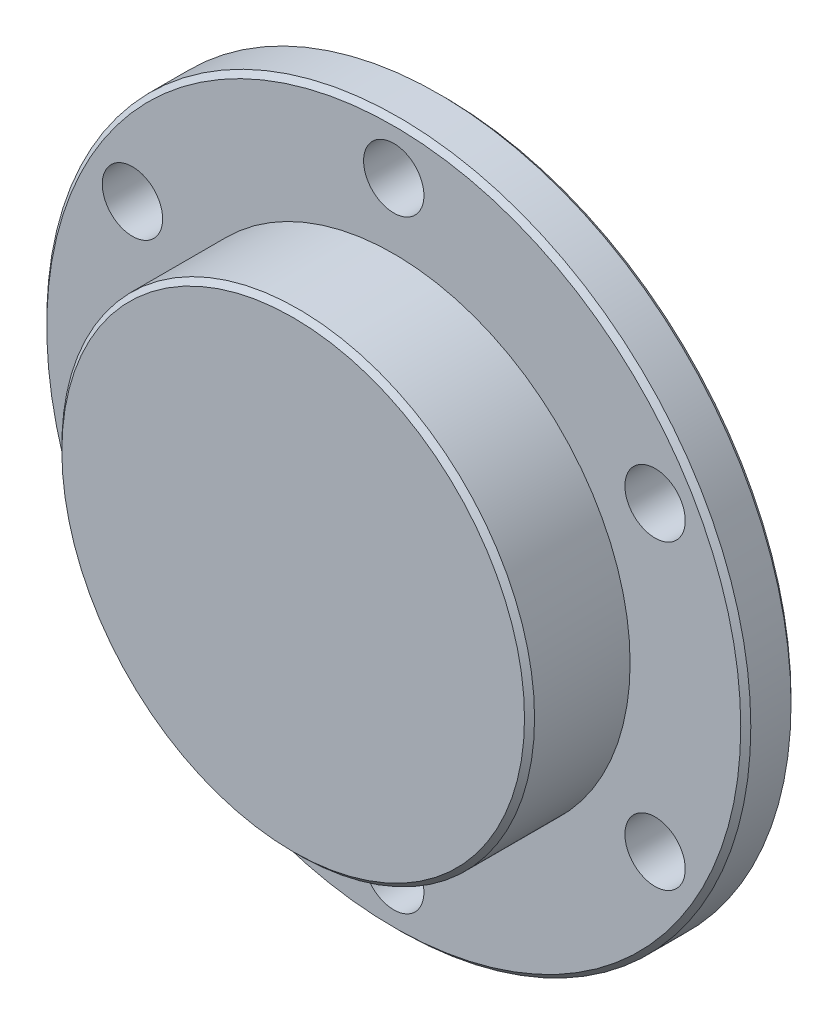
ISO-10303-21;
HEADER;
FILE_DESCRIPTION(('STEP AP214'),'2;1');
FILE_NAME('part.step','',(''),(''),'','','');
FILE_SCHEMA(('AUTOMOTIVE_DESIGN { 1 0 10303 214 1 1 1 1 }'));
ENDSEC;
DATA;
#1=APPLICATION_CONTEXT('core data for automotive mechanical design processes');
#2=APPLICATION_PROTOCOL_DEFINITION('international standard','automotive_design',2000,#1);
#3=PRODUCT_CONTEXT('',#1,'mechanical');
#4=PRODUCT('Part','Part','',(#3));
#5=PRODUCT_RELATED_PRODUCT_CATEGORY('part','',(#4));
#6=PRODUCT_DEFINITION_FORMATION('','',#4);
#7=PRODUCT_DEFINITION_CONTEXT('part definition',#1,'design');
#8=PRODUCT_DEFINITION('design','',#6,#7);
#9=PRODUCT_DEFINITION_SHAPE('','',#8);
#10=(LENGTH_UNIT() NAMED_UNIT(*) SI_UNIT(.MILLI.,.METRE.));
#11=(NAMED_UNIT(*) PLANE_ANGLE_UNIT() SI_UNIT($,.RADIAN.));
#12=(NAMED_UNIT(*) SI_UNIT($,.STERADIAN.) SOLID_ANGLE_UNIT());
#13=UNCERTAINTY_MEASURE_WITH_UNIT(LENGTH_MEASURE(1.E-05),#10,'distance_accuracy_value','');
#14=(GEOMETRIC_REPRESENTATION_CONTEXT(3) GLOBAL_UNCERTAINTY_ASSIGNED_CONTEXT((#13)) GLOBAL_UNIT_ASSIGNED_CONTEXT((#10,
#11,#12)) REPRESENTATION_CONTEXT('',''));
#15=CARTESIAN_POINT('',(0.,0.,0.));
#16=DIRECTION('',(0.,0.,1.));
#17=DIRECTION('',(1.,0.,0.));
#18=AXIS2_PLACEMENT_3D('',#15,#16,#17);
#19=CARTESIAN_POINT('',(0.,0.,5.));
#20=DIRECTION('',(0.,0.,1.));
#21=DIRECTION('',(1.,0.,0.));
#22=AXIS2_PLACEMENT_3D('',#19,#20,#21);
#23=PLANE('',#22);
#24=CARTESIAN_POINT('',(0.,0.,5.));
#25=DIRECTION('',(0.,0.,1.));
#26=DIRECTION('',(1.,0.,0.));
#27=AXIS2_PLACEMENT_3D('',#24,#25,#26);
#28=CIRCLE('',#27,34.5);
#29=CARTESIAN_POINT('',(34.5,0.,5.));
#30=VERTEX_POINT('',#29);
#31=EDGE_CURVE('E39',#30,#30,#28,.T.);
#32=ORIENTED_EDGE('',*,*,#31,.T.);
#33=EDGE_LOOP('',(#32));
#34=FACE_BOUND('',#33,.T.);
#35=CARTESIAN_POINT('',(-25.9807621135323,15.0000000000001,5.));
#36=DIRECTION('',(0.,0.,1.));
#37=DIRECTION('',(1.,0.,0.));
#38=AXIS2_PLACEMENT_3D('',#35,#36,#37);
#39=CIRCLE('',#38,3.);
#40=CARTESIAN_POINT('',(-22.9807621135323,15.0000000000001,5.));
#41=VERTEX_POINT('',#40);
#42=EDGE_CURVE('E65',#41,#41,#39,.T.);
#43=ORIENTED_EDGE('',*,*,#42,.F.);
#44=EDGE_LOOP('',(#43));
#45=FACE_BOUND('',#44,.T.);
#46=CARTESIAN_POINT('',(-25.9807621135326,-14.9999999999995,5.));
#47=DIRECTION('',(0.,0.,1.));
#48=DIRECTION('',(1.,0.,0.));
#49=AXIS2_PLACEMENT_3D('',#46,#47,#48);
#50=CIRCLE('',#49,3.00000000000036);
#51=CARTESIAN_POINT('',(-22.9807621135322,-14.9999999999995,5.));
#52=VERTEX_POINT('',#51);
#53=EDGE_CURVE('E64',#52,#52,#50,.T.);
#54=ORIENTED_EDGE('',*,*,#53,.F.);
#55=EDGE_LOOP('',(#54));
#56=FACE_BOUND('',#55,.T.);
#57=CARTESIAN_POINT('',(-2.09489001666563E-13,-30.,5.));
#58=DIRECTION('',(0.,0.,1.));
#59=DIRECTION('',(1.,0.,0.));
#60=AXIS2_PLACEMENT_3D('',#57,#58,#59);
#61=CIRCLE('',#60,3.);
#62=CARTESIAN_POINT('',(2.99999999999979,-30.,5.));
#63=VERTEX_POINT('',#62);
#64=EDGE_CURVE('E69',#63,#63,#61,.T.);
#65=ORIENTED_EDGE('',*,*,#64,.F.);
#66=EDGE_LOOP('',(#65));
#67=FACE_BOUND('',#66,.T.);
#68=CARTESIAN_POINT('',(25.9807621135331,-15.0000000000001,5.));
#69=DIRECTION('',(0.,0.,1.));
#70=DIRECTION('',(1.,0.,0.));
#71=AXIS2_PLACEMENT_3D('',#68,#69,#70);
#72=CIRCLE('',#71,3.);
#73=CARTESIAN_POINT('',(28.9807621135331,-15.0000000000001,5.));
#74=VERTEX_POINT('',#73);
#75=EDGE_CURVE('E73',#74,#74,#72,.T.);
#76=ORIENTED_EDGE('',*,*,#75,.F.);
#77=EDGE_LOOP('',(#76));
#78=FACE_BOUND('',#77,.T.);
#79=CARTESIAN_POINT('',(25.9807621135332,14.9999999999999,5.));
#80=DIRECTION('',(0.,0.,1.));
#81=DIRECTION('',(1.,0.,0.));
#82=AXIS2_PLACEMENT_3D('',#79,#80,#81);
#83=CIRCLE('',#82,3.);
#84=CARTESIAN_POINT('',(28.9807621135332,14.9999999999999,5.));
#85=VERTEX_POINT('',#84);
#86=EDGE_CURVE('E77',#85,#85,#83,.T.);
#87=ORIENTED_EDGE('',*,*,#86,.F.);
#88=EDGE_LOOP('',(#87));
#89=FACE_BOUND('',#88,.T.);
#90=CARTESIAN_POINT('',(7.79702456335843E-13,29.9999999999996,5.));
#91=DIRECTION('',(0.,0.,1.));
#92=DIRECTION('',(1.,0.,0.));
#93=AXIS2_PLACEMENT_3D('',#90,#91,#92);
#94=CIRCLE('',#93,2.99999999999936);
#95=CARTESIAN_POINT('',(3.00000000000014,29.9999999999996,5.));
#96=VERTEX_POINT('',#95);
#97=EDGE_CURVE('E81',#96,#96,#94,.T.);
#98=ORIENTED_EDGE('',*,*,#97,.F.);
#99=EDGE_LOOP('',(#98));
#100=FACE_BOUND('',#99,.T.);
#101=CARTESIAN_POINT('',(0.,0.,5.));
#102=DIRECTION('',(0.,0.,1.));
#103=DIRECTION('',(1.,0.,0.));
#104=AXIS2_PLACEMENT_3D('',#101,#102,#103);
#105=CIRCLE('',#104,23.5);
#106=CARTESIAN_POINT('',(23.5,0.,5.));
#107=VERTEX_POINT('',#106);
#108=EDGE_CURVE('E60',#107,#107,#105,.T.);
#109=ORIENTED_EDGE('',*,*,#108,.F.);
#110=EDGE_LOOP('',(#109));
#111=FACE_BOUND('',#110,.T.);
#112=ADVANCED_FACE('F28',(#34,#45,#56,#67,#78,#89,#100,#111),#23,.T.);
#113=CARTESIAN_POINT('',(0.,0.,5.));
#114=DIRECTION('',(0.,0.,-1.));
#115=DIRECTION('',(-1.,0.,0.));
#116=AXIS2_PLACEMENT_3D('',#113,#114,#115);
#117=CYLINDRICAL_SURFACE('',#116,35.);
#118=CARTESIAN_POINT('',(0.,0.,0.500000000000007));
#119=DIRECTION('',(0.,0.,1.));
#120=DIRECTION('',(1.,0.,0.));
#121=AXIS2_PLACEMENT_3D('',#118,#119,#120);
#122=CIRCLE('',#121,35.);
#123=CARTESIAN_POINT('',(35.,0.,0.500000000000007));
#124=VERTEX_POINT('',#123);
#125=EDGE_CURVE('E43',#124,#124,#122,.T.);
#126=ORIENTED_EDGE('',*,*,#125,.T.);
#127=EDGE_LOOP('',(#126));
#128=FACE_BOUND('',#127,.T.);
#129=CARTESIAN_POINT('',(0.,0.,4.49999999999999));
#130=DIRECTION('',(0.,0.,1.));
#131=DIRECTION('',(1.,0.,0.));
#132=AXIS2_PLACEMENT_3D('',#129,#130,#131);
#133=CIRCLE('',#132,35.);
#134=CARTESIAN_POINT('',(35.,0.,4.49999999999999));
#135=VERTEX_POINT('',#134);
#136=EDGE_CURVE('E48',#135,#135,#133,.F.);
#137=ORIENTED_EDGE('',*,*,#136,.T.);
#138=EDGE_LOOP('',(#137));
#139=FACE_BOUND('',#138,.T.);
#140=ADVANCED_FACE('F108',(#128,#139),#117,.T.);
#141=CARTESIAN_POINT('',(0.,0.,0.));
#142=DIRECTION('',(0.,0.,1.));
#143=DIRECTION('',(1.,0.,0.));
#144=AXIS2_PLACEMENT_3D('',#141,#142,#143);
#145=PLANE('',#144);
#146=CARTESIAN_POINT('',(0.,0.,0.));
#147=DIRECTION('',(0.,0.,1.));
#148=DIRECTION('',(1.,0.,0.));
#149=AXIS2_PLACEMENT_3D('',#146,#147,#148);
#150=CIRCLE('',#149,20.5);
#151=CARTESIAN_POINT('',(20.5,0.,0.));
#152=VERTEX_POINT('',#151);
#153=EDGE_CURVE('E51',#152,#152,#150,.T.);
#154=ORIENTED_EDGE('',*,*,#153,.T.);
#155=EDGE_LOOP('',(#154));
#156=FACE_BOUND('',#155,.T.);
#157=CARTESIAN_POINT('',(0.,0.,0.));
#158=DIRECTION('',(0.,0.,1.));
#159=DIRECTION('',(1.,0.,0.));
#160=AXIS2_PLACEMENT_3D('',#157,#158,#159);
#161=CIRCLE('',#160,34.5);
#162=CARTESIAN_POINT('',(34.5,0.,0.));
#163=VERTEX_POINT('',#162);
#164=EDGE_CURVE('E54',#163,#163,#161,.F.);
#165=ORIENTED_EDGE('',*,*,#164,.T.);
#166=EDGE_LOOP('',(#165));
#167=FACE_BOUND('',#166,.T.);
#168=CARTESIAN_POINT('',(-25.9807621135323,15.0000000000001,0.));
#169=DIRECTION('',(0.,0.,1.));
#170=DIRECTION('',(1.,0.,0.));
#171=AXIS2_PLACEMENT_3D('',#168,#169,#170);
#172=CIRCLE('',#171,3.);
#173=CARTESIAN_POINT('',(-22.9807621135323,15.0000000000001,0.));
#174=VERTEX_POINT('',#173);
#175=EDGE_CURVE('E61',#174,#174,#172,.T.);
#176=ORIENTED_EDGE('',*,*,#175,.T.);
#177=EDGE_LOOP('',(#176));
#178=FACE_BOUND('',#177,.T.);
#179=CARTESIAN_POINT('',(-25.9807621135326,-14.9999999999995,0.));
#180=DIRECTION('',(0.,0.,1.));
#181=DIRECTION('',(1.,0.,0.));
#182=AXIS2_PLACEMENT_3D('',#179,#180,#181);
#183=CIRCLE('',#182,3.00000000000036);
#184=CARTESIAN_POINT('',(-22.9807621135322,-14.9999999999995,0.));
#185=VERTEX_POINT('',#184);
#186=EDGE_CURVE('E66',#185,#185,#183,.T.);
#187=ORIENTED_EDGE('',*,*,#186,.T.);
#188=EDGE_LOOP('',(#187));
#189=FACE_BOUND('',#188,.T.);
#190=CARTESIAN_POINT('',(-2.09489001666563E-13,-30.,0.));
#191=DIRECTION('',(0.,0.,1.));
#192=DIRECTION('',(1.,0.,0.));
#193=AXIS2_PLACEMENT_3D('',#190,#191,#192);
#194=CIRCLE('',#193,3.);
#195=CARTESIAN_POINT('',(2.99999999999979,-30.,0.));
#196=VERTEX_POINT('',#195);
#197=EDGE_CURVE('E70',#196,#196,#194,.T.);
#198=ORIENTED_EDGE('',*,*,#197,.T.);
#199=EDGE_LOOP('',(#198));
#200=FACE_BOUND('',#199,.T.);
#201=CARTESIAN_POINT('',(25.9807621135331,-15.0000000000001,0.));
#202=DIRECTION('',(0.,0.,1.));
#203=DIRECTION('',(1.,0.,0.));
#204=AXIS2_PLACEMENT_3D('',#201,#202,#203);
#205=CIRCLE('',#204,3.);
#206=CARTESIAN_POINT('',(28.9807621135331,-15.0000000000001,0.));
#207=VERTEX_POINT('',#206);
#208=EDGE_CURVE('E74',#207,#207,#205,.T.);
#209=ORIENTED_EDGE('',*,*,#208,.T.);
#210=EDGE_LOOP('',(#209));
#211=FACE_BOUND('',#210,.T.);
#212=CARTESIAN_POINT('',(25.9807621135332,14.9999999999999,0.));
#213=DIRECTION('',(0.,0.,1.));
#214=DIRECTION('',(1.,0.,0.));
#215=AXIS2_PLACEMENT_3D('',#212,#213,#214);
#216=CIRCLE('',#215,3.);
#217=CARTESIAN_POINT('',(28.9807621135332,14.9999999999999,0.));
#218=VERTEX_POINT('',#217);
#219=EDGE_CURVE('E78',#218,#218,#216,.T.);
#220=ORIENTED_EDGE('',*,*,#219,.T.);
#221=EDGE_LOOP('',(#220));
#222=FACE_BOUND('',#221,.T.);
#223=CARTESIAN_POINT('',(7.79702456335843E-13,29.9999999999996,0.));
#224=DIRECTION('',(0.,0.,1.));
#225=DIRECTION('',(1.,0.,0.));
#226=AXIS2_PLACEMENT_3D('',#223,#224,#225);
#227=CIRCLE('',#226,2.99999999999936);
#228=CARTESIAN_POINT('',(3.00000000000014,29.9999999999996,0.));
#229=VERTEX_POINT('',#228);
#230=EDGE_CURVE('E82',#229,#229,#227,.T.);
#231=ORIENTED_EDGE('',*,*,#230,.T.);
#232=EDGE_LOOP('',(#231));
#233=FACE_BOUND('',#232,.T.);
#234=ADVANCED_FACE('F126',(#156,#167,#178,#189,#200,#211,#222,#233),#145,.F.);
#235=CARTESIAN_POINT('',(0.,0.,15.));
#236=DIRECTION('',(0.,0.,-1.));
#237=DIRECTION('',(-1.,0.,0.));
#238=AXIS2_PLACEMENT_3D('',#235,#236,#237);
#239=CYLINDRICAL_SURFACE('',#238,23.5);
#240=CARTESIAN_POINT('',(0.,0.,14.5));
#241=DIRECTION('',(0.,0.,1.));
#242=DIRECTION('',(1.,0.,0.));
#243=AXIS2_PLACEMENT_3D('',#240,#241,#242);
#244=CIRCLE('',#243,23.5);
#245=CARTESIAN_POINT('',(23.5,0.,14.5));
#246=VERTEX_POINT('',#245);
#247=EDGE_CURVE('E10',#246,#246,#244,.F.);
#248=ORIENTED_EDGE('',*,*,#247,.T.);
#249=EDGE_LOOP('',(#248));
#250=FACE_BOUND('',#249,.T.);
#251=ORIENTED_EDGE('',*,*,#108,.T.);
#252=EDGE_LOOP('',(#251));
#253=FACE_BOUND('',#252,.T.);
#254=ADVANCED_FACE('F123',(#250,#253),#239,.T.);
#255=CARTESIAN_POINT('',(0.,0.,15.));
#256=DIRECTION('',(0.,0.,1.));
#257=DIRECTION('',(1.,0.,0.));
#258=AXIS2_PLACEMENT_3D('',#255,#256,#257);
#259=PLANE('',#258);
#260=CARTESIAN_POINT('',(0.,0.,15.));
#261=DIRECTION('',(0.,0.,1.));
#262=DIRECTION('',(1.,0.,0.));
#263=AXIS2_PLACEMENT_3D('',#260,#261,#262);
#264=CIRCLE('',#263,23.);
#265=CARTESIAN_POINT('',(23.,0.,15.));
#266=VERTEX_POINT('',#265);
#267=EDGE_CURVE('E35',#266,#266,#264,.T.);
#268=ORIENTED_EDGE('',*,*,#267,.T.);
#269=EDGE_LOOP('',(#268));
#270=FACE_BOUND('',#269,.T.);
#271=ADVANCED_FACE('F125',(#270),#259,.T.);
#272=CARTESIAN_POINT('',(0.,0.,12.));
#273=DIRECTION('',(0.,0.,-1.));
#274=DIRECTION('',(-1.,0.,0.));
#275=AXIS2_PLACEMENT_3D('',#272,#273,#274);
#276=CYLINDRICAL_SURFACE('',#275,20.);
#277=CARTESIAN_POINT('',(0.,0.,0.5));
#278=DIRECTION('',(0.,0.,1.));
#279=DIRECTION('',(1.,0.,0.));
#280=AXIS2_PLACEMENT_3D('',#277,#278,#279);
#281=CIRCLE('',#280,20.);
#282=CARTESIAN_POINT('',(20.,0.,0.5));
#283=VERTEX_POINT('',#282);
#284=EDGE_CURVE('E57',#283,#283,#281,.F.);
#285=ORIENTED_EDGE('',*,*,#284,.T.);
#286=EDGE_LOOP('',(#285));
#287=FACE_BOUND('',#286,.T.);
#288=CARTESIAN_POINT('',(0.,0.,12.));
#289=DIRECTION('',(0.,0.,-1.));
#290=DIRECTION('',(-1.,0.,0.));
#291=AXIS2_PLACEMENT_3D('',#288,#289,#290);
#292=CIRCLE('',#291,20.);
#293=CARTESIAN_POINT('',(-20.,0.,12.));
#294=VERTEX_POINT('',#293);
#295=EDGE_CURVE('E85',#294,#294,#292,.T.);
#296=ORIENTED_EDGE('',*,*,#295,.F.);
#297=EDGE_LOOP('',(#296));
#298=FACE_BOUND('',#297,.T.);
#299=ADVANCED_FACE('F132',(#287,#298),#276,.F.);
#300=CARTESIAN_POINT('',(0.,0.,12.));
#301=DIRECTION('',(0.,0.,-1.));
#302=DIRECTION('',(-1.,0.,0.));
#303=AXIS2_PLACEMENT_3D('',#300,#301,#302);
#304=PLANE('',#303);
#305=ORIENTED_EDGE('',*,*,#295,.T.);
#306=EDGE_LOOP('',(#305));
#307=FACE_BOUND('',#306,.T.);
#308=ADVANCED_FACE('F189',(#307),#304,.T.);
#309=CARTESIAN_POINT('',(7.79702456335843E-13,29.9999999999996,-7.));
#310=DIRECTION('',(0.,0.,1.));
#311=DIRECTION('',(1.,0.,0.));
#312=AXIS2_PLACEMENT_3D('',#309,#310,#311);
#313=CYLINDRICAL_SURFACE('',#312,2.99999999999936);
#314=ORIENTED_EDGE('',*,*,#97,.T.);
#315=EDGE_LOOP('',(#314));
#316=FACE_BOUND('',#315,.T.);
#317=ORIENTED_EDGE('',*,*,#230,.F.);
#318=EDGE_LOOP('',(#317));
#319=FACE_BOUND('',#318,.T.);
#320=ADVANCED_FACE('F265',(#316,#319),#313,.F.);
#321=CARTESIAN_POINT('',(25.9807621135332,14.9999999999999,-7.));
#322=DIRECTION('',(0.,0.,1.));
#323=DIRECTION('',(1.,0.,0.));
#324=AXIS2_PLACEMENT_3D('',#321,#322,#323);
#325=CYLINDRICAL_SURFACE('',#324,3.);
#326=ORIENTED_EDGE('',*,*,#86,.T.);
#327=EDGE_LOOP('',(#326));
#328=FACE_BOUND('',#327,.T.);
#329=ORIENTED_EDGE('',*,*,#219,.F.);
#330=EDGE_LOOP('',(#329));
#331=FACE_BOUND('',#330,.T.);
#332=ADVANCED_FACE('F255',(#328,#331),#325,.F.);
#333=CARTESIAN_POINT('',(25.9807621135331,-15.0000000000001,-7.));
#334=DIRECTION('',(0.,0.,1.));
#335=DIRECTION('',(1.,0.,0.));
#336=AXIS2_PLACEMENT_3D('',#333,#334,#335);
#337=CYLINDRICAL_SURFACE('',#336,3.);
#338=ORIENTED_EDGE('',*,*,#75,.T.);
#339=EDGE_LOOP('',(#338));
#340=FACE_BOUND('',#339,.T.);
#341=ORIENTED_EDGE('',*,*,#208,.F.);
#342=EDGE_LOOP('',(#341));
#343=FACE_BOUND('',#342,.T.);
#344=ADVANCED_FACE('F245',(#340,#343),#337,.F.);
#345=CARTESIAN_POINT('',(-2.09489001666563E-13,-30.,-7.));
#346=DIRECTION('',(0.,0.,1.));
#347=DIRECTION('',(1.,0.,0.));
#348=AXIS2_PLACEMENT_3D('',#345,#346,#347);
#349=CYLINDRICAL_SURFACE('',#348,3.);
#350=ORIENTED_EDGE('',*,*,#64,.T.);
#351=EDGE_LOOP('',(#350));
#352=FACE_BOUND('',#351,.T.);
#353=ORIENTED_EDGE('',*,*,#197,.F.);
#354=EDGE_LOOP('',(#353));
#355=FACE_BOUND('',#354,.T.);
#356=ADVANCED_FACE('F235',(#352,#355),#349,.F.);
#357=CARTESIAN_POINT('',(-25.9807621135326,-14.9999999999995,-7.));
#358=DIRECTION('',(0.,0.,1.));
#359=DIRECTION('',(1.,0.,0.));
#360=AXIS2_PLACEMENT_3D('',#357,#358,#359);
#361=CYLINDRICAL_SURFACE('',#360,3.00000000000036);
#362=ORIENTED_EDGE('',*,*,#53,.T.);
#363=EDGE_LOOP('',(#362));
#364=FACE_BOUND('',#363,.T.);
#365=ORIENTED_EDGE('',*,*,#186,.F.);
#366=EDGE_LOOP('',(#365));
#367=FACE_BOUND('',#366,.T.);
#368=ADVANCED_FACE('F226',(#364,#367),#361,.F.);
#369=CARTESIAN_POINT('',(-25.9807621135323,15.0000000000001,-7.));
#370=DIRECTION('',(0.,0.,1.));
#371=DIRECTION('',(1.,0.,0.));
#372=AXIS2_PLACEMENT_3D('',#369,#370,#371);
#373=CYLINDRICAL_SURFACE('',#372,3.);
#374=ORIENTED_EDGE('',*,*,#42,.T.);
#375=EDGE_LOOP('',(#374));
#376=FACE_BOUND('',#375,.T.);
#377=ORIENTED_EDGE('',*,*,#175,.F.);
#378=EDGE_LOOP('',(#377));
#379=FACE_BOUND('',#378,.T.);
#380=ADVANCED_FACE('F103',(#376,#379),#373,.F.);
#381=CARTESIAN_POINT('',(0.,0.,0.5));
#382=DIRECTION('',(0.,0.,-1.));
#383=DIRECTION('',(-1.,0.,0.));
#384=AXIS2_PLACEMENT_3D('',#381,#382,#383);
#385=CONICAL_SURFACE('',#384,20.,0.785398163397452);
#386=ORIENTED_EDGE('',*,*,#153,.F.);
#387=EDGE_LOOP('',(#386));
#388=FACE_BOUND('',#387,.T.);
#389=ORIENTED_EDGE('',*,*,#284,.F.);
#390=EDGE_LOOP('',(#389));
#391=FACE_BOUND('',#390,.T.);
#392=ADVANCED_FACE('F141',(#388,#391),#385,.F.);
#393=CARTESIAN_POINT('',(0.,0.,0.500000000000007));
#394=DIRECTION('',(0.,0.,1.));
#395=DIRECTION('',(1.,0.,0.));
#396=AXIS2_PLACEMENT_3D('',#393,#394,#395);
#397=CONICAL_SURFACE('',#396,35.,0.785398163397448);
#398=ORIENTED_EDGE('',*,*,#164,.F.);
#399=EDGE_LOOP('',(#398));
#400=FACE_BOUND('',#399,.T.);
#401=ORIENTED_EDGE('',*,*,#125,.F.);
#402=EDGE_LOOP('',(#401));
#403=FACE_BOUND('',#402,.T.);
#404=ADVANCED_FACE('F144',(#400,#403),#397,.T.);
#405=CARTESIAN_POINT('',(0.,0.,5.));
#406=DIRECTION('',(0.,0.,-1.));
#407=DIRECTION('',(-1.,0.,0.));
#408=AXIS2_PLACEMENT_3D('',#405,#406,#407);
#409=CONICAL_SURFACE('',#408,34.5,0.785398163397448);
#410=ORIENTED_EDGE('',*,*,#136,.F.);
#411=EDGE_LOOP('',(#410));
#412=FACE_BOUND('',#411,.T.);
#413=ORIENTED_EDGE('',*,*,#31,.F.);
#414=EDGE_LOOP('',(#413));
#415=FACE_BOUND('',#414,.T.);
#416=ADVANCED_FACE('F147',(#412,#415),#409,.T.);
#417=CARTESIAN_POINT('',(0.,0.,15.));
#418=DIRECTION('',(0.,0.,-1.));
#419=DIRECTION('',(-1.,0.,0.));
#420=AXIS2_PLACEMENT_3D('',#417,#418,#419);
#421=CONICAL_SURFACE('',#420,23.,0.785398163397431);
#422=ORIENTED_EDGE('',*,*,#247,.F.);
#423=EDGE_LOOP('',(#422));
#424=FACE_BOUND('',#423,.T.);
#425=ORIENTED_EDGE('',*,*,#267,.F.);
#426=EDGE_LOOP('',(#425));
#427=FACE_BOUND('',#426,.T.);
#428=ADVANCED_FACE('F30',(#424,#427),#421,.T.);
#429=CLOSED_SHELL('',(#112,#140,#234,#254,#271,#299,#308,#320,#332,#344,#356,#368,#380,#392,
#404,#416,#428));
#430=MANIFOLD_SOLID_BREP('B2',#429);
#431=ADVANCED_BREP_SHAPE_REPRESENTATION('',(#18,#430),#14);
#432=SHAPE_DEFINITION_REPRESENTATION(#9,#431);
ENDSEC;
END-ISO-10303-21;
